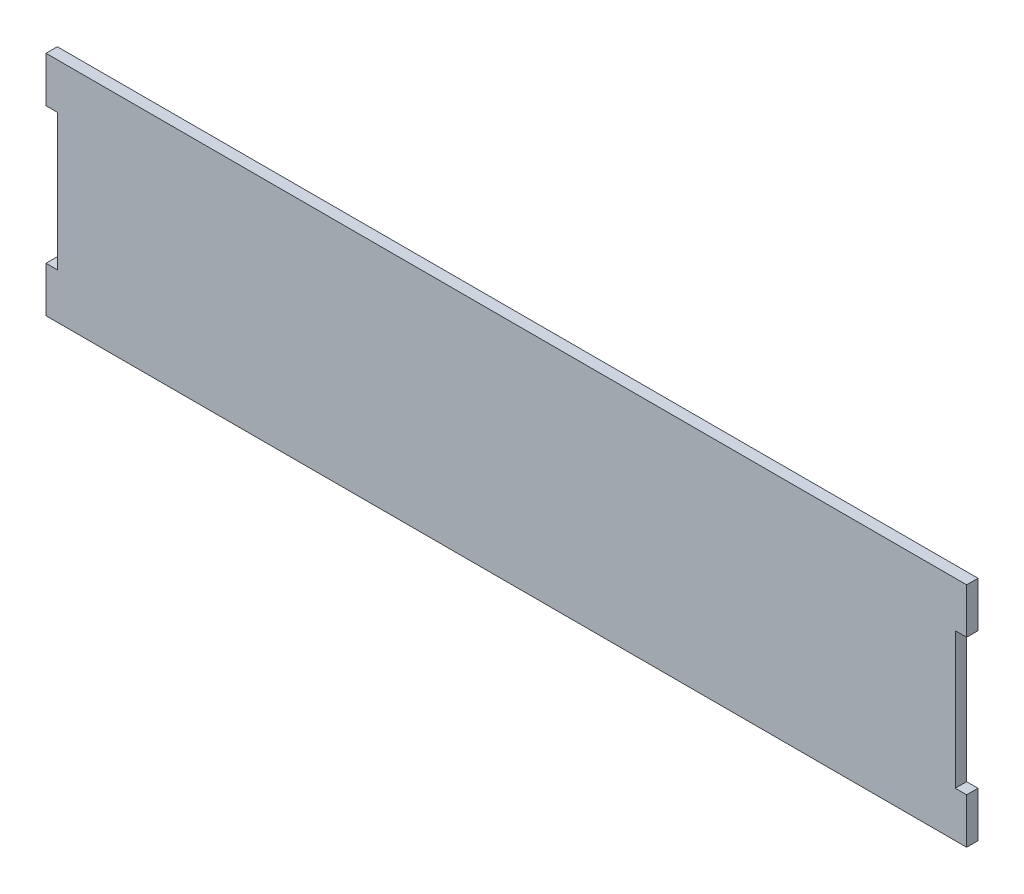
ISO-10303-21;
HEADER;
FILE_DESCRIPTION(('STEP AP214'),'2;1');
FILE_NAME('part.step','',(''),(''),'','','');
FILE_SCHEMA(('AUTOMOTIVE_DESIGN { 1 0 10303 214 1 1 1 1 }'));
ENDSEC;
DATA;
#1=APPLICATION_CONTEXT('core data for automotive mechanical design processes');
#2=APPLICATION_PROTOCOL_DEFINITION('international standard','automotive_design',2000,#1);
#3=PRODUCT_CONTEXT('',#1,'mechanical');
#4=PRODUCT('Part','Part','',(#3));
#5=PRODUCT_RELATED_PRODUCT_CATEGORY('part','',(#4));
#6=PRODUCT_DEFINITION_FORMATION('','',#4);
#7=PRODUCT_DEFINITION_CONTEXT('part definition',#1,'design');
#8=PRODUCT_DEFINITION('design','',#6,#7);
#9=PRODUCT_DEFINITION_SHAPE('','',#8);
#10=(LENGTH_UNIT() NAMED_UNIT(*) SI_UNIT(.MILLI.,.METRE.));
#11=(NAMED_UNIT(*) PLANE_ANGLE_UNIT() SI_UNIT($,.RADIAN.));
#12=(NAMED_UNIT(*) SI_UNIT($,.STERADIAN.) SOLID_ANGLE_UNIT());
#13=UNCERTAINTY_MEASURE_WITH_UNIT(LENGTH_MEASURE(1.E-05),#10,'distance_accuracy_value','');
#14=(GEOMETRIC_REPRESENTATION_CONTEXT(3) GLOBAL_UNCERTAINTY_ASSIGNED_CONTEXT((#13)) GLOBAL_UNIT_ASSIGNED_CONTEXT((#10,
#11,#12)) REPRESENTATION_CONTEXT('',''));
#15=CARTESIAN_POINT('',(0.,0.,0.));
#16=DIRECTION('',(0.,0.,1.));
#17=DIRECTION('',(1.,0.,0.));
#18=AXIS2_PLACEMENT_3D('',#15,#16,#17);
#19=CARTESIAN_POINT('',(0.,0.,5.));
#20=DIRECTION('',(-1.,0.,0.));
#21=DIRECTION('',(0.,0.,1.));
#22=AXIS2_PLACEMENT_3D('',#19,#20,#21);
#23=PLANE('',#22);
#24=DIRECTION('',(0.,1.,0.));
#25=VECTOR('',#24,1.);
#26=CARTESIAN_POINT('',(0.,0.,0.));
#27=LINE('',#26,#25);
#28=CARTESIAN_POINT('',(0.,-100.,0.));
#29=VERTEX_POINT('',#28);
#30=CARTESIAN_POINT('',(0.,-80.0000000000001,0.));
#31=VERTEX_POINT('',#30);
#32=EDGE_CURVE('E176',#29,#31,#27,.T.);
#33=ORIENTED_EDGE('',*,*,#32,.T.);
#34=DIRECTION('',(0.,0.,1.));
#35=VECTOR('',#34,1.);
#36=CARTESIAN_POINT('',(0.,-80.0000000000001,0.));
#37=LINE('',#36,#35);
#38=CARTESIAN_POINT('',(0.,-80.0000000000001,5.));
#39=VERTEX_POINT('',#38);
#40=EDGE_CURVE('E201',#31,#39,#37,.T.);
#41=ORIENTED_EDGE('',*,*,#40,.T.);
#42=DIRECTION('',(0.,1.,0.));
#43=VECTOR('',#42,1.);
#44=CARTESIAN_POINT('',(0.,0.,5.));
#45=LINE('',#44,#43);
#46=CARTESIAN_POINT('',(0.,-100.,5.));
#47=VERTEX_POINT('',#46);
#48=EDGE_CURVE('E188',#47,#39,#45,.T.);
#49=ORIENTED_EDGE('',*,*,#48,.F.);
#50=DIRECTION('',(0.,0.,-1.));
#51=VECTOR('',#50,1.);
#52=CARTESIAN_POINT('',(0.,-100.,5.));
#53=LINE('',#52,#51);
#54=EDGE_CURVE('E159',#47,#29,#53,.T.);
#55=ORIENTED_EDGE('',*,*,#54,.T.);
#56=EDGE_LOOP('',(#33,#41,#49,#55));
#57=FACE_BOUND('',#56,.T.);
#58=ADVANCED_FACE('F34',(#57),#23,.F.);
#59=CARTESIAN_POINT('',(-405.,0.,5.));
#60=DIRECTION('',(1.,0.,0.));
#61=DIRECTION('',(0.,0.,-1.));
#62=AXIS2_PLACEMENT_3D('',#59,#60,#61);
#63=PLANE('',#62);
#64=DIRECTION('',(0.,-1.,0.));
#65=VECTOR('',#64,1.);
#66=CARTESIAN_POINT('',(-405.,0.,0.));
#67=LINE('',#66,#65);
#68=CARTESIAN_POINT('',(-405.,0.,0.));
#69=VERTEX_POINT('',#68);
#70=CARTESIAN_POINT('',(-405.,-20.,0.));
#71=VERTEX_POINT('',#70);
#72=EDGE_CURVE('E143',#69,#71,#67,.T.);
#73=ORIENTED_EDGE('',*,*,#72,.T.);
#74=DIRECTION('',(0.,0.,1.));
#75=VECTOR('',#74,1.);
#76=CARTESIAN_POINT('',(-405.,-20.,0.));
#77=LINE('',#76,#75);
#78=CARTESIAN_POINT('',(-405.,-20.,5.));
#79=VERTEX_POINT('',#78);
#80=EDGE_CURVE('E123',#71,#79,#77,.T.);
#81=ORIENTED_EDGE('',*,*,#80,.T.);
#82=DIRECTION('',(0.,-1.,0.));
#83=VECTOR('',#82,1.);
#84=CARTESIAN_POINT('',(-405.,0.,5.));
#85=LINE('',#84,#83);
#86=CARTESIAN_POINT('',(-405.,0.,5.));
#87=VERTEX_POINT('',#86);
#88=EDGE_CURVE('E183',#87,#79,#85,.T.);
#89=ORIENTED_EDGE('',*,*,#88,.F.);
#90=DIRECTION('',(0.,0.,-1.));
#91=VECTOR('',#90,1.);
#92=CARTESIAN_POINT('',(-405.,0.,5.));
#93=LINE('',#92,#91);
#94=EDGE_CURVE('E42',#87,#69,#93,.T.);
#95=ORIENTED_EDGE('',*,*,#94,.T.);
#96=EDGE_LOOP('',(#73,#81,#89,#95));
#97=FACE_BOUND('',#96,.T.);
#98=ADVANCED_FACE('F148',(#97),#63,.F.);
#99=CARTESIAN_POINT('',(0.,-20.,5.));
#100=VERTEX_POINT('',#99);
#101=CARTESIAN_POINT('',(0.,0.,5.));
#102=VERTEX_POINT('',#101);
#103=EDGE_CURVE('E153',#100,#102,#45,.T.);
#104=ORIENTED_EDGE('',*,*,#103,.F.);
#105=DIRECTION('',(0.,0.,1.));
#106=VECTOR('',#105,1.);
#107=CARTESIAN_POINT('',(0.,-20.,0.));
#108=LINE('',#107,#106);
#109=CARTESIAN_POINT('',(0.,-20.,0.));
#110=VERTEX_POINT('',#109);
#111=EDGE_CURVE('E211',#110,#100,#108,.T.);
#112=ORIENTED_EDGE('',*,*,#111,.F.);
#113=CARTESIAN_POINT('',(0.,0.,0.));
#114=VERTEX_POINT('',#113);
#115=EDGE_CURVE('E179',#110,#114,#27,.T.);
#116=ORIENTED_EDGE('',*,*,#115,.T.);
#117=DIRECTION('',(0.,0.,-1.));
#118=VECTOR('',#117,1.);
#119=CARTESIAN_POINT('',(0.,0.,5.));
#120=LINE('',#119,#118);
#121=EDGE_CURVE('E11',#102,#114,#120,.T.);
#122=ORIENTED_EDGE('',*,*,#121,.F.);
#123=EDGE_LOOP('',(#104,#112,#116,#122));
#124=FACE_BOUND('',#123,.T.);
#125=ADVANCED_FACE('F36',(#124),#23,.F.);
#126=CARTESIAN_POINT('',(0.,0.,5.));
#127=DIRECTION('',(0.,-1.,0.));
#128=DIRECTION('',(1.,0.,0.));
#129=AXIS2_PLACEMENT_3D('',#126,#127,#128);
#130=PLANE('',#129);
#131=DIRECTION('',(-1.,0.,0.));
#132=VECTOR('',#131,1.);
#133=CARTESIAN_POINT('',(0.,0.,0.));
#134=LINE('',#133,#132);
#135=EDGE_CURVE('E155',#114,#69,#134,.T.);
#136=ORIENTED_EDGE('',*,*,#135,.T.);
#137=ORIENTED_EDGE('',*,*,#94,.F.);
#138=DIRECTION('',(-1.,0.,0.));
#139=VECTOR('',#138,1.);
#140=CARTESIAN_POINT('',(0.,0.,5.));
#141=LINE('',#140,#139);
#142=EDGE_CURVE('E186',#102,#87,#141,.T.);
#143=ORIENTED_EDGE('',*,*,#142,.F.);
#144=ORIENTED_EDGE('',*,*,#121,.T.);
#145=EDGE_LOOP('',(#136,#137,#143,#144));
#146=FACE_BOUND('',#145,.T.);
#147=ADVANCED_FACE('F235',(#146),#130,.F.);
#148=CARTESIAN_POINT('',(-405.,-80.0000000000001,5.));
#149=VERTEX_POINT('',#148);
#150=CARTESIAN_POINT('',(-405.,-100.,5.));
#151=VERTEX_POINT('',#150);
#152=EDGE_CURVE('E185',#149,#151,#85,.T.);
#153=ORIENTED_EDGE('',*,*,#152,.F.);
#154=DIRECTION('',(0.,0.,1.));
#155=VECTOR('',#154,1.);
#156=CARTESIAN_POINT('',(-405.,-80.0000000000001,0.));
#157=LINE('',#156,#155);
#158=CARTESIAN_POINT('',(-405.,-80.0000000000001,0.));
#159=VERTEX_POINT('',#158);
#160=EDGE_CURVE('E191',#159,#149,#157,.T.);
#161=ORIENTED_EDGE('',*,*,#160,.F.);
#162=CARTESIAN_POINT('',(-405.,-100.,0.));
#163=VERTEX_POINT('',#162);
#164=EDGE_CURVE('E151',#159,#163,#67,.T.);
#165=ORIENTED_EDGE('',*,*,#164,.T.);
#166=DIRECTION('',(0.,0.,-1.));
#167=VECTOR('',#166,1.);
#168=CARTESIAN_POINT('',(-405.,-100.,5.));
#169=LINE('',#168,#167);
#170=EDGE_CURVE('E162',#151,#163,#169,.T.);
#171=ORIENTED_EDGE('',*,*,#170,.F.);
#172=EDGE_LOOP('',(#153,#161,#165,#171));
#173=FACE_BOUND('',#172,.T.);
#174=ADVANCED_FACE('F256',(#173),#63,.F.);
#175=CARTESIAN_POINT('',(0.,-100.,5.));
#176=DIRECTION('',(0.,1.,0.));
#177=DIRECTION('',(-1.,0.,0.));
#178=AXIS2_PLACEMENT_3D('',#175,#176,#177);
#179=PLANE('',#178);
#180=DIRECTION('',(1.,0.,0.));
#181=VECTOR('',#180,1.);
#182=CARTESIAN_POINT('',(0.,-100.,0.));
#183=LINE('',#182,#181);
#184=EDGE_CURVE('E150',#163,#29,#183,.T.);
#185=ORIENTED_EDGE('',*,*,#184,.T.);
#186=ORIENTED_EDGE('',*,*,#54,.F.);
#187=DIRECTION('',(1.,0.,0.));
#188=VECTOR('',#187,1.);
#189=CARTESIAN_POINT('',(0.,-100.,5.));
#190=LINE('',#189,#188);
#191=EDGE_CURVE('E163',#151,#47,#190,.T.);
#192=ORIENTED_EDGE('',*,*,#191,.F.);
#193=ORIENTED_EDGE('',*,*,#170,.T.);
#194=EDGE_LOOP('',(#185,#186,#192,#193));
#195=FACE_BOUND('',#194,.T.);
#196=ADVANCED_FACE('F169',(#195),#179,.F.);
#197=CARTESIAN_POINT('',(0.,0.,5.));
#198=DIRECTION('',(0.,0.,-1.));
#199=DIRECTION('',(-1.,0.,0.));
#200=AXIS2_PLACEMENT_3D('',#197,#198,#199);
#201=PLANE('',#200);
#202=DIRECTION('',(0.,-1.,0.));
#203=VECTOR('',#202,1.);
#204=CARTESIAN_POINT('',(-5.,-75.0000000000001,5.));
#205=LINE('',#204,#203);
#206=CARTESIAN_POINT('',(-5.,-20.,5.));
#207=VERTEX_POINT('',#206);
#208=CARTESIAN_POINT('',(-5.,-80.0000000000001,5.));
#209=VERTEX_POINT('',#208);
#210=EDGE_CURVE('E206',#207,#209,#205,.T.);
#211=ORIENTED_EDGE('',*,*,#210,.F.);
#212=DIRECTION('',(-1.,0.,0.));
#213=VECTOR('',#212,1.);
#214=CARTESIAN_POINT('',(0.,-20.,5.));
#215=LINE('',#214,#213);
#216=EDGE_CURVE('E203',#100,#207,#215,.T.);
#217=ORIENTED_EDGE('',*,*,#216,.F.);
#218=ORIENTED_EDGE('',*,*,#103,.T.);
#219=ORIENTED_EDGE('',*,*,#142,.T.);
#220=ORIENTED_EDGE('',*,*,#88,.T.);
#221=DIRECTION('',(-1.,0.,0.));
#222=VECTOR('',#221,1.);
#223=CARTESIAN_POINT('',(-405.,-20.,5.));
#224=LINE('',#223,#222);
#225=CARTESIAN_POINT('',(-400.,-20.,5.));
#226=VERTEX_POINT('',#225);
#227=EDGE_CURVE('E129',#226,#79,#224,.T.);
#228=ORIENTED_EDGE('',*,*,#227,.F.);
#229=DIRECTION('',(0.,1.,0.));
#230=VECTOR('',#229,1.);
#231=CARTESIAN_POINT('',(-400.,-25.,5.));
#232=LINE('',#231,#230);
#233=CARTESIAN_POINT('',(-400.,-80.0000000000001,5.));
#234=VERTEX_POINT('',#233);
#235=EDGE_CURVE('E216',#234,#226,#232,.T.);
#236=ORIENTED_EDGE('',*,*,#235,.F.);
#237=DIRECTION('',(1.,0.,0.));
#238=VECTOR('',#237,1.);
#239=CARTESIAN_POINT('',(-405.,-80.0000000000001,5.));
#240=LINE('',#239,#238);
#241=EDGE_CURVE('E134',#149,#234,#240,.T.);
#242=ORIENTED_EDGE('',*,*,#241,.F.);
#243=ORIENTED_EDGE('',*,*,#152,.T.);
#244=ORIENTED_EDGE('',*,*,#191,.T.);
#245=ORIENTED_EDGE('',*,*,#48,.T.);
#246=DIRECTION('',(1.,0.,0.));
#247=VECTOR('',#246,1.);
#248=CARTESIAN_POINT('',(0.,-80.0000000000001,5.));
#249=LINE('',#248,#247);
#250=EDGE_CURVE('E204',#209,#39,#249,.T.);
#251=ORIENTED_EDGE('',*,*,#250,.F.);
#252=EDGE_LOOP('',(#211,#217,#218,#219,#220,#228,#236,#242,#243,#244,#245,#251));
#253=FACE_BOUND('',#252,.T.);
#254=ADVANCED_FACE('F229',(#253),#201,.F.);
#255=CARTESIAN_POINT('',(0.,0.,0.));
#256=DIRECTION('',(0.,0.,-1.));
#257=DIRECTION('',(-1.,0.,0.));
#258=AXIS2_PLACEMENT_3D('',#255,#256,#257);
#259=PLANE('',#258);
#260=DIRECTION('',(-1.,0.,0.));
#261=VECTOR('',#260,1.);
#262=CARTESIAN_POINT('',(0.,-20.,0.));
#263=LINE('',#262,#261);
#264=CARTESIAN_POINT('',(-5.,-20.,0.));
#265=VERTEX_POINT('',#264);
#266=EDGE_CURVE('E214',#110,#265,#263,.T.);
#267=ORIENTED_EDGE('',*,*,#266,.T.);
#268=DIRECTION('',(0.,-1.,0.));
#269=VECTOR('',#268,1.);
#270=CARTESIAN_POINT('',(-5.,-75.0000000000001,0.));
#271=LINE('',#270,#269);
#272=CARTESIAN_POINT('',(-5.,-80.0000000000001,0.));
#273=VERTEX_POINT('',#272);
#274=EDGE_CURVE('E56',#265,#273,#271,.T.);
#275=ORIENTED_EDGE('',*,*,#274,.T.);
#276=DIRECTION('',(1.,0.,0.));
#277=VECTOR('',#276,1.);
#278=CARTESIAN_POINT('',(0.,-80.0000000000001,0.));
#279=LINE('',#278,#277);
#280=EDGE_CURVE('E49',#273,#31,#279,.T.);
#281=ORIENTED_EDGE('',*,*,#280,.T.);
#282=ORIENTED_EDGE('',*,*,#32,.F.);
#283=ORIENTED_EDGE('',*,*,#184,.F.);
#284=ORIENTED_EDGE('',*,*,#164,.F.);
#285=DIRECTION('',(1.,0.,0.));
#286=VECTOR('',#285,1.);
#287=CARTESIAN_POINT('',(-405.,-80.0000000000001,0.));
#288=LINE('',#287,#286);
#289=CARTESIAN_POINT('',(-400.,-80.0000000000001,0.));
#290=VERTEX_POINT('',#289);
#291=EDGE_CURVE('E193',#159,#290,#288,.T.);
#292=ORIENTED_EDGE('',*,*,#291,.T.);
#293=DIRECTION('',(0.,1.,0.));
#294=VECTOR('',#293,1.);
#295=CARTESIAN_POINT('',(-400.,-25.,0.));
#296=LINE('',#295,#294);
#297=CARTESIAN_POINT('',(-400.,-20.,0.));
#298=VERTEX_POINT('',#297);
#299=EDGE_CURVE('E145',#290,#298,#296,.T.);
#300=ORIENTED_EDGE('',*,*,#299,.T.);
#301=DIRECTION('',(-1.,0.,0.));
#302=VECTOR('',#301,1.);
#303=CARTESIAN_POINT('',(-405.,-20.,0.));
#304=LINE('',#303,#302);
#305=EDGE_CURVE('E126',#298,#71,#304,.T.);
#306=ORIENTED_EDGE('',*,*,#305,.T.);
#307=ORIENTED_EDGE('',*,*,#72,.F.);
#308=ORIENTED_EDGE('',*,*,#135,.F.);
#309=ORIENTED_EDGE('',*,*,#115,.F.);
#310=EDGE_LOOP('',(#267,#275,#281,#282,#283,#284,#292,#300,#306,#307,#308,#309));
#311=FACE_BOUND('',#310,.T.);
#312=ADVANCED_FACE('F141',(#311),#259,.T.);
#313=CARTESIAN_POINT('',(-405.,-80.0000000000001,0.));
#314=DIRECTION('',(0.,-1.,0.));
#315=DIRECTION('',(0.,0.,-1.));
#316=AXIS2_PLACEMENT_3D('',#313,#314,#315);
#317=PLANE('',#316);
#318=ORIENTED_EDGE('',*,*,#241,.T.);
#319=DIRECTION('',(0.,0.,1.));
#320=VECTOR('',#319,1.);
#321=CARTESIAN_POINT('',(-400.,-80.0000000000001,0.));
#322=LINE('',#321,#320);
#323=EDGE_CURVE('E180',#290,#234,#322,.T.);
#324=ORIENTED_EDGE('',*,*,#323,.F.);
#325=ORIENTED_EDGE('',*,*,#291,.F.);
#326=ORIENTED_EDGE('',*,*,#160,.T.);
#327=EDGE_LOOP('',(#318,#324,#325,#326));
#328=FACE_BOUND('',#327,.T.);
#329=ADVANCED_FACE('F269',(#328),#317,.F.);
#330=CARTESIAN_POINT('',(-405.,-20.,0.));
#331=DIRECTION('',(0.,1.,0.));
#332=DIRECTION('',(0.,0.,1.));
#333=AXIS2_PLACEMENT_3D('',#330,#331,#332);
#334=PLANE('',#333);
#335=ORIENTED_EDGE('',*,*,#227,.T.);
#336=ORIENTED_EDGE('',*,*,#80,.F.);
#337=ORIENTED_EDGE('',*,*,#305,.F.);
#338=DIRECTION('',(0.,0.,1.));
#339=VECTOR('',#338,1.);
#340=CARTESIAN_POINT('',(-400.,-20.,0.));
#341=LINE('',#340,#339);
#342=EDGE_CURVE('E135',#298,#226,#341,.T.);
#343=ORIENTED_EDGE('',*,*,#342,.T.);
#344=EDGE_LOOP('',(#335,#336,#337,#343));
#345=FACE_BOUND('',#344,.T.);
#346=ADVANCED_FACE('F125',(#345),#334,.F.);
#347=CARTESIAN_POINT('',(-400.,-25.,0.));
#348=DIRECTION('',(1.,0.,0.));
#349=DIRECTION('',(0.,0.,-1.));
#350=AXIS2_PLACEMENT_3D('',#347,#348,#349);
#351=PLANE('',#350);
#352=ORIENTED_EDGE('',*,*,#235,.T.);
#353=ORIENTED_EDGE('',*,*,#342,.F.);
#354=ORIENTED_EDGE('',*,*,#299,.F.);
#355=ORIENTED_EDGE('',*,*,#323,.T.);
#356=EDGE_LOOP('',(#352,#353,#354,#355));
#357=FACE_BOUND('',#356,.T.);
#358=ADVANCED_FACE('F225',(#357),#351,.F.);
#359=CARTESIAN_POINT('',(0.,-20.,0.));
#360=DIRECTION('',(0.,1.,0.));
#361=DIRECTION('',(0.,0.,1.));
#362=AXIS2_PLACEMENT_3D('',#359,#360,#361);
#363=PLANE('',#362);
#364=ORIENTED_EDGE('',*,*,#216,.T.);
#365=DIRECTION('',(0.,0.,1.));
#366=VECTOR('',#365,1.);
#367=CARTESIAN_POINT('',(-5.,-20.,0.));
#368=LINE('',#367,#366);
#369=EDGE_CURVE('E213',#265,#207,#368,.T.);
#370=ORIENTED_EDGE('',*,*,#369,.F.);
#371=ORIENTED_EDGE('',*,*,#266,.F.);
#372=ORIENTED_EDGE('',*,*,#111,.T.);
#373=EDGE_LOOP('',(#364,#370,#371,#372));
#374=FACE_BOUND('',#373,.T.);
#375=ADVANCED_FACE('F240',(#374),#363,.F.);
#376=CARTESIAN_POINT('',(0.,-80.0000000000001,0.));
#377=DIRECTION('',(0.,-1.,0.));
#378=DIRECTION('',(0.,0.,-1.));
#379=AXIS2_PLACEMENT_3D('',#376,#377,#378);
#380=PLANE('',#379);
#381=ORIENTED_EDGE('',*,*,#250,.T.);
#382=ORIENTED_EDGE('',*,*,#40,.F.);
#383=ORIENTED_EDGE('',*,*,#280,.F.);
#384=DIRECTION('',(0.,0.,1.));
#385=VECTOR('',#384,1.);
#386=CARTESIAN_POINT('',(-5.,-80.0000000000001,0.));
#387=LINE('',#386,#385);
#388=EDGE_CURVE('E199',#273,#209,#387,.T.);
#389=ORIENTED_EDGE('',*,*,#388,.T.);
#390=EDGE_LOOP('',(#381,#382,#383,#389));
#391=FACE_BOUND('',#390,.T.);
#392=ADVANCED_FACE('F244',(#391),#380,.F.);
#393=CARTESIAN_POINT('',(-5.,-75.0000000000001,0.));
#394=DIRECTION('',(-1.,0.,0.));
#395=DIRECTION('',(0.,0.,1.));
#396=AXIS2_PLACEMENT_3D('',#393,#394,#395);
#397=PLANE('',#396);
#398=ORIENTED_EDGE('',*,*,#210,.T.);
#399=ORIENTED_EDGE('',*,*,#388,.F.);
#400=ORIENTED_EDGE('',*,*,#274,.F.);
#401=ORIENTED_EDGE('',*,*,#369,.T.);
#402=EDGE_LOOP('',(#398,#399,#400,#401));
#403=FACE_BOUND('',#402,.T.);
#404=ADVANCED_FACE('F242',(#403),#397,.F.);
#405=CLOSED_SHELL('',(#58,#98,#125,#147,#174,#196,#254,#312,#329,#346,#358,#375,#392,#404));
#406=MANIFOLD_SOLID_BREP('B2',#405);
#407=ADVANCED_BREP_SHAPE_REPRESENTATION('',(#18,#406),#14);
#408=SHAPE_DEFINITION_REPRESENTATION(#9,#407);
ENDSEC;
END-ISO-10303-21;
